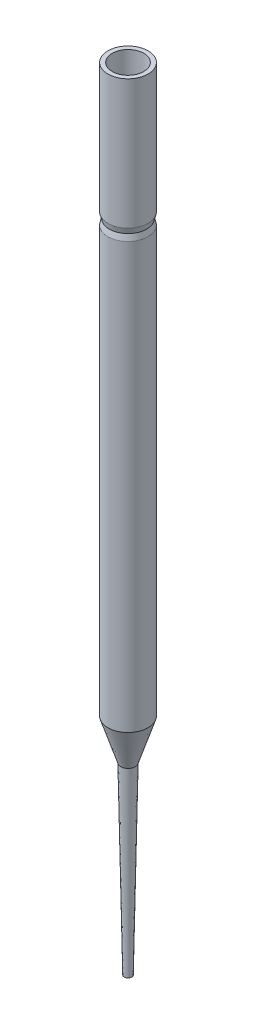
ISO-10303-21;
HEADER;
FILE_DESCRIPTION(('STEP AP214'),'2;1');
FILE_NAME('part.step','',(''),(''),'','','');
FILE_SCHEMA(('AUTOMOTIVE_DESIGN { 1 0 10303 214 1 1 1 1 }'));
ENDSEC;
DATA;
#1=APPLICATION_CONTEXT('core data for automotive mechanical design processes');
#2=APPLICATION_PROTOCOL_DEFINITION('international standard','automotive_design',2000,#1);
#3=PRODUCT_CONTEXT('',#1,'mechanical');
#4=PRODUCT('Part','Part','',(#3));
#5=PRODUCT_RELATED_PRODUCT_CATEGORY('part','',(#4));
#6=PRODUCT_DEFINITION_FORMATION('','',#4);
#7=PRODUCT_DEFINITION_CONTEXT('part definition',#1,'design');
#8=PRODUCT_DEFINITION('design','',#6,#7);
#9=PRODUCT_DEFINITION_SHAPE('','',#8);
#10=(LENGTH_UNIT() NAMED_UNIT(*) SI_UNIT(.MILLI.,.METRE.));
#11=(NAMED_UNIT(*) PLANE_ANGLE_UNIT() SI_UNIT($,.RADIAN.));
#12=(NAMED_UNIT(*) SI_UNIT($,.STERADIAN.) SOLID_ANGLE_UNIT());
#13=UNCERTAINTY_MEASURE_WITH_UNIT(LENGTH_MEASURE(1.E-05),#10,'distance_accuracy_value','');
#14=(GEOMETRIC_REPRESENTATION_CONTEXT(3) GLOBAL_UNCERTAINTY_ASSIGNED_CONTEXT((#13)) GLOBAL_UNIT_ASSIGNED_CONTEXT((#10,
#11,#12)) REPRESENTATION_CONTEXT('',''));
#15=CARTESIAN_POINT('',(0.,0.,0.));
#16=DIRECTION('',(0.,0.,1.));
#17=DIRECTION('',(1.,0.,0.));
#18=AXIS2_PLACEMENT_3D('',#15,#16,#17);
#19=CARTESIAN_POINT('',(-2.75,0.,0.));
#20=DIRECTION('',(0.,-1.,0.));
#21=DIRECTION('',(0.,0.,-1.));
#22=AXIS2_PLACEMENT_3D('',#19,#20,#21);
#23=PLANE('',#22);
#24=CARTESIAN_POINT('',(0.,0.,0.));
#25=DIRECTION('',(0.,-1.,0.));
#26=DIRECTION('',(0.,0.,-1.));
#27=AXIS2_PLACEMENT_3D('',#24,#25,#26);
#28=CIRCLE('',#27,3.5);
#29=CARTESIAN_POINT('',(0.,0.,-3.5));
#30=VERTEX_POINT('',#29);
#31=EDGE_CURVE('E10',#30,#30,#28,.T.);
#32=ORIENTED_EDGE('',*,*,#31,.F.);
#33=EDGE_LOOP('',(#32));
#34=FACE_BOUND('',#33,.T.);
#35=CARTESIAN_POINT('',(0.,0.,0.));
#36=DIRECTION('',(0.,-1.,0.));
#37=DIRECTION('',(0.,0.,-1.));
#38=AXIS2_PLACEMENT_3D('',#35,#36,#37);
#39=CIRCLE('',#38,2.75);
#40=CARTESIAN_POINT('',(0.,0.,-2.75));
#41=VERTEX_POINT('',#40);
#42=EDGE_CURVE('E77',#41,#41,#39,.T.);
#43=ORIENTED_EDGE('',*,*,#42,.T.);
#44=EDGE_LOOP('',(#43));
#45=FACE_BOUND('',#44,.T.);
#46=ADVANCED_FACE('F31',(#34,#45),#23,.F.);
#47=CARTESIAN_POINT('',(0.,0.,0.));
#48=DIRECTION('',(0.,-1.,0.));
#49=DIRECTION('',(0.,0.,-1.));
#50=AXIS2_PLACEMENT_3D('',#47,#48,#49);
#51=CYLINDRICAL_SURFACE('',#50,3.5);
#52=CARTESIAN_POINT('',(0.,-22.5,0.));
#53=DIRECTION('',(0.,-1.,0.));
#54=DIRECTION('',(0.,0.,-1.));
#55=AXIS2_PLACEMENT_3D('',#52,#53,#54);
#56=CIRCLE('',#55,3.5);
#57=CARTESIAN_POINT('',(0.,-22.5,-3.5));
#58=VERTEX_POINT('',#57);
#59=EDGE_CURVE('E37',#58,#58,#56,.T.);
#60=ORIENTED_EDGE('',*,*,#59,.F.);
#61=EDGE_LOOP('',(#60));
#62=FACE_BOUND('',#61,.T.);
#63=ORIENTED_EDGE('',*,*,#31,.T.);
#64=EDGE_LOOP('',(#63));
#65=FACE_BOUND('',#64,.T.);
#66=ADVANCED_FACE('F150',(#62,#65),#51,.T.);
#67=CARTESIAN_POINT('',(0.,-22.5,0.));
#68=DIRECTION('',(0.,1.,0.));
#69=DIRECTION('',(0.,0.,1.));
#70=AXIS2_PLACEMENT_3D('',#67,#68,#69);
#71=CONICAL_SURFACE('',#70,3.5,0.244978663126861);
#72=CARTESIAN_POINT('',(0.,-23.5,0.));
#73=DIRECTION('',(0.,-1.,0.));
#74=DIRECTION('',(0.,0.,-1.));
#75=AXIS2_PLACEMENT_3D('',#72,#73,#74);
#76=CIRCLE('',#75,3.25);
#77=CARTESIAN_POINT('',(0.,-23.5,-3.25));
#78=VERTEX_POINT('',#77);
#79=EDGE_CURVE('E41',#78,#78,#76,.T.);
#80=ORIENTED_EDGE('',*,*,#79,.F.);
#81=EDGE_LOOP('',(#80));
#82=FACE_BOUND('',#81,.T.);
#83=ORIENTED_EDGE('',*,*,#59,.T.);
#84=EDGE_LOOP('',(#83));
#85=FACE_BOUND('',#84,.T.);
#86=ADVANCED_FACE('F145',(#82,#85),#71,.T.);
#87=CARTESIAN_POINT('',(0.,-23.5,0.));
#88=DIRECTION('',(0.,-1.,0.));
#89=DIRECTION('',(0.,0.,-1.));
#90=AXIS2_PLACEMENT_3D('',#87,#88,#89);
#91=CONICAL_SURFACE('',#90,3.25,0.244978663126863);
#92=CARTESIAN_POINT('',(0.,-24.5,0.));
#93=DIRECTION('',(0.,-1.,0.));
#94=DIRECTION('',(0.,0.,-1.));
#95=AXIS2_PLACEMENT_3D('',#92,#93,#94);
#96=CIRCLE('',#95,3.5);
#97=CARTESIAN_POINT('',(0.,-24.5,-3.5));
#98=VERTEX_POINT('',#97);
#99=EDGE_CURVE('E45',#98,#98,#96,.T.);
#100=ORIENTED_EDGE('',*,*,#99,.F.);
#101=EDGE_LOOP('',(#100));
#102=FACE_BOUND('',#101,.T.);
#103=ORIENTED_EDGE('',*,*,#79,.T.);
#104=EDGE_LOOP('',(#103));
#105=FACE_BOUND('',#104,.T.);
#106=ADVANCED_FACE('F139',(#102,#105),#91,.T.);
#107=CARTESIAN_POINT('',(0.,0.,0.));
#108=DIRECTION('',(0.,-1.,0.));
#109=DIRECTION('',(0.,0.,-1.));
#110=AXIS2_PLACEMENT_3D('',#107,#108,#109);
#111=CYLINDRICAL_SURFACE('',#110,3.49999999999999);
#112=CARTESIAN_POINT('',(0.,-98.5,0.));
#113=DIRECTION('',(0.,-1.,0.));
#114=DIRECTION('',(0.,0.,-1.));
#115=AXIS2_PLACEMENT_3D('',#112,#113,#114);
#116=CIRCLE('',#115,3.49999999999999);
#117=CARTESIAN_POINT('',(0.,-98.5,-3.49999999999999));
#118=VERTEX_POINT('',#117);
#119=EDGE_CURVE('E50',#118,#118,#116,.T.);
#120=ORIENTED_EDGE('',*,*,#119,.F.);
#121=EDGE_LOOP('',(#120));
#122=FACE_BOUND('',#121,.T.);
#123=ORIENTED_EDGE('',*,*,#99,.T.);
#124=EDGE_LOOP('',(#123));
#125=FACE_BOUND('',#124,.T.);
#126=ADVANCED_FACE('F133',(#122,#125),#111,.T.);
#127=CARTESIAN_POINT('',(0.,-98.5,0.));
#128=DIRECTION('',(0.,1.,0.));
#129=DIRECTION('',(0.,0.,1.));
#130=AXIS2_PLACEMENT_3D('',#127,#128,#129);
#131=CONICAL_SURFACE('',#130,3.49999999999999,0.310998280605539);
#132=CARTESIAN_POINT('',(0.,-105.5,0.));
#133=DIRECTION('',(0.,-1.,0.));
#134=DIRECTION('',(0.,0.,-1.));
#135=AXIS2_PLACEMENT_3D('',#132,#133,#134);
#136=CIRCLE('',#135,1.25);
#137=CARTESIAN_POINT('',(0.,-105.5,-1.25));
#138=VERTEX_POINT('',#137);
#139=EDGE_CURVE('E53',#138,#138,#136,.T.);
#140=ORIENTED_EDGE('',*,*,#139,.F.);
#141=EDGE_LOOP('',(#140));
#142=FACE_BOUND('',#141,.T.);
#143=ORIENTED_EDGE('',*,*,#119,.T.);
#144=EDGE_LOOP('',(#143));
#145=FACE_BOUND('',#144,.T.);
#146=ADVANCED_FACE('F127',(#142,#145),#131,.T.);
#147=CARTESIAN_POINT('',(0.,-105.5,0.));
#148=DIRECTION('',(0.,1.,0.));
#149=DIRECTION('',(0.,0.,1.));
#150=AXIS2_PLACEMENT_3D('',#147,#148,#149);
#151=CONICAL_SURFACE('',#150,1.25,0.0187478031977444);
#152=CARTESIAN_POINT('',(0.,-137.5,0.));
#153=DIRECTION('',(0.,-1.,0.));
#154=DIRECTION('',(0.,0.,-1.));
#155=AXIS2_PLACEMENT_3D('',#152,#153,#154);
#156=CIRCLE('',#155,0.65);
#157=CARTESIAN_POINT('',(0.,-137.5,-0.65));
#158=VERTEX_POINT('',#157);
#159=EDGE_CURVE('E56',#158,#158,#156,.T.);
#160=ORIENTED_EDGE('',*,*,#159,.F.);
#161=EDGE_LOOP('',(#160));
#162=FACE_BOUND('',#161,.T.);
#163=ORIENTED_EDGE('',*,*,#139,.T.);
#164=EDGE_LOOP('',(#163));
#165=FACE_BOUND('',#164,.T.);
#166=ADVANCED_FACE('F121',(#162,#165),#151,.T.);
#167=CARTESIAN_POINT('',(-0.4,-137.5,0.));
#168=DIRECTION('',(0.,1.,0.));
#169=DIRECTION('',(0.,0.,1.));
#170=AXIS2_PLACEMENT_3D('',#167,#168,#169);
#171=PLANE('',#170);
#172=CARTESIAN_POINT('',(0.,-137.5,0.));
#173=DIRECTION('',(0.,-1.,0.));
#174=DIRECTION('',(0.,0.,-1.));
#175=AXIS2_PLACEMENT_3D('',#172,#173,#174);
#176=CIRCLE('',#175,0.4);
#177=CARTESIAN_POINT('',(0.,-137.5,-0.4));
#178=VERTEX_POINT('',#177);
#179=EDGE_CURVE('E59',#178,#178,#176,.T.);
#180=ORIENTED_EDGE('',*,*,#179,.F.);
#181=EDGE_LOOP('',(#180));
#182=FACE_BOUND('',#181,.T.);
#183=ORIENTED_EDGE('',*,*,#159,.T.);
#184=EDGE_LOOP('',(#183));
#185=FACE_BOUND('',#184,.T.);
#186=ADVANCED_FACE('F115',(#182,#185),#171,.F.);
#187=CARTESIAN_POINT('',(0.,-137.5,0.));
#188=DIRECTION('',(0.,1.,0.));
#189=DIRECTION('',(0.,0.,1.));
#190=AXIS2_PLACEMENT_3D('',#187,#188,#189);
#191=CONICAL_SURFACE('',#190,0.4,0.0187478031977444);
#192=CARTESIAN_POINT('',(0.,-105.5,0.));
#193=DIRECTION('',(0.,-1.,0.));
#194=DIRECTION('',(0.,0.,-1.));
#195=AXIS2_PLACEMENT_3D('',#192,#193,#194);
#196=CIRCLE('',#195,1.);
#197=CARTESIAN_POINT('',(0.,-105.5,-1.));
#198=VERTEX_POINT('',#197);
#199=EDGE_CURVE('E62',#198,#198,#196,.T.);
#200=ORIENTED_EDGE('',*,*,#199,.F.);
#201=EDGE_LOOP('',(#200));
#202=FACE_BOUND('',#201,.T.);
#203=ORIENTED_EDGE('',*,*,#179,.T.);
#204=EDGE_LOOP('',(#203));
#205=FACE_BOUND('',#204,.T.);
#206=ADVANCED_FACE('F109',(#202,#205),#191,.F.);
#207=CARTESIAN_POINT('',(0.,-105.5,0.));
#208=DIRECTION('',(0.,1.,0.));
#209=DIRECTION('',(0.,0.,1.));
#210=AXIS2_PLACEMENT_3D('',#207,#208,#209);
#211=CONICAL_SURFACE('',#210,1.,0.244978663126864);
#212=CARTESIAN_POINT('',(0.,-98.5,0.));
#213=DIRECTION('',(0.,-1.,0.));
#214=DIRECTION('',(0.,0.,-1.));
#215=AXIS2_PLACEMENT_3D('',#212,#213,#214);
#216=CIRCLE('',#215,2.75);
#217=CARTESIAN_POINT('',(0.,-98.5,-2.75));
#218=VERTEX_POINT('',#217);
#219=EDGE_CURVE('E65',#218,#218,#216,.T.);
#220=ORIENTED_EDGE('',*,*,#219,.F.);
#221=EDGE_LOOP('',(#220));
#222=FACE_BOUND('',#221,.T.);
#223=ORIENTED_EDGE('',*,*,#199,.T.);
#224=EDGE_LOOP('',(#223));
#225=FACE_BOUND('',#224,.T.);
#226=ADVANCED_FACE('F103',(#222,#225),#211,.F.);
#227=CARTESIAN_POINT('',(0.,0.,0.));
#228=DIRECTION('',(0.,-1.,0.));
#229=DIRECTION('',(0.,0.,-1.));
#230=AXIS2_PLACEMENT_3D('',#227,#228,#229);
#231=CYLINDRICAL_SURFACE('',#230,2.75);
#232=CARTESIAN_POINT('',(0.,-24.5,0.));
#233=DIRECTION('',(0.,-1.,0.));
#234=DIRECTION('',(0.,0.,-1.));
#235=AXIS2_PLACEMENT_3D('',#232,#233,#234);
#236=CIRCLE('',#235,2.75);
#237=CARTESIAN_POINT('',(0.,-24.5,-2.75));
#238=VERTEX_POINT('',#237);
#239=EDGE_CURVE('E68',#238,#238,#236,.T.);
#240=ORIENTED_EDGE('',*,*,#239,.F.);
#241=EDGE_LOOP('',(#240));
#242=FACE_BOUND('',#241,.T.);
#243=ORIENTED_EDGE('',*,*,#219,.T.);
#244=EDGE_LOOP('',(#243));
#245=FACE_BOUND('',#244,.T.);
#246=ADVANCED_FACE('F97',(#242,#245),#231,.F.);
#247=CARTESIAN_POINT('',(0.,-24.5,0.));
#248=DIRECTION('',(0.,-1.,0.));
#249=DIRECTION('',(0.,0.,-1.));
#250=AXIS2_PLACEMENT_3D('',#247,#248,#249);
#251=CONICAL_SURFACE('',#250,2.75,0.244978663126864);
#252=CARTESIAN_POINT('',(0.,-23.5,0.));
#253=DIRECTION('',(0.,-1.,0.));
#254=DIRECTION('',(0.,0.,-1.));
#255=AXIS2_PLACEMENT_3D('',#252,#253,#254);
#256=CIRCLE('',#255,2.5);
#257=CARTESIAN_POINT('',(0.,-23.5,-2.5));
#258=VERTEX_POINT('',#257);
#259=EDGE_CURVE('E71',#258,#258,#256,.T.);
#260=ORIENTED_EDGE('',*,*,#259,.F.);
#261=EDGE_LOOP('',(#260));
#262=FACE_BOUND('',#261,.T.);
#263=ORIENTED_EDGE('',*,*,#239,.T.);
#264=EDGE_LOOP('',(#263));
#265=FACE_BOUND('',#264,.T.);
#266=ADVANCED_FACE('F91',(#262,#265),#251,.F.);
#267=CARTESIAN_POINT('',(0.,-23.5,0.));
#268=DIRECTION('',(0.,1.,0.));
#269=DIRECTION('',(0.,0.,1.));
#270=AXIS2_PLACEMENT_3D('',#267,#268,#269);
#271=CONICAL_SURFACE('',#270,2.5,0.244978663126861);
#272=CARTESIAN_POINT('',(0.,-22.5,0.));
#273=DIRECTION('',(0.,-1.,0.));
#274=DIRECTION('',(0.,0.,-1.));
#275=AXIS2_PLACEMENT_3D('',#272,#273,#274);
#276=CIRCLE('',#275,2.75);
#277=CARTESIAN_POINT('',(0.,-22.5,-2.75));
#278=VERTEX_POINT('',#277);
#279=EDGE_CURVE('E74',#278,#278,#276,.T.);
#280=ORIENTED_EDGE('',*,*,#279,.F.);
#281=EDGE_LOOP('',(#280));
#282=FACE_BOUND('',#281,.T.);
#283=ORIENTED_EDGE('',*,*,#259,.T.);
#284=EDGE_LOOP('',(#283));
#285=FACE_BOUND('',#284,.T.);
#286=ADVANCED_FACE('F85',(#282,#285),#271,.F.);
#287=CARTESIAN_POINT('',(0.,0.,0.));
#288=DIRECTION('',(0.,-1.,0.));
#289=DIRECTION('',(0.,0.,-1.));
#290=AXIS2_PLACEMENT_3D('',#287,#288,#289);
#291=CYLINDRICAL_SURFACE('',#290,2.75);
#292=ORIENTED_EDGE('',*,*,#42,.F.);
#293=EDGE_LOOP('',(#292));
#294=FACE_BOUND('',#293,.T.);
#295=ORIENTED_EDGE('',*,*,#279,.T.);
#296=EDGE_LOOP('',(#295));
#297=FACE_BOUND('',#296,.T.);
#298=ADVANCED_FACE('F82',(#294,#297),#291,.F.);
#299=CLOSED_SHELL('',(#46,#66,#86,#106,#126,#146,#166,#186,#206,#226,#246,#266,#286,#298));
#300=MANIFOLD_SOLID_BREP('B2',#299);
#301=ADVANCED_BREP_SHAPE_REPRESENTATION('',(#18,#300),#14);
#302=SHAPE_DEFINITION_REPRESENTATION(#9,#301);
ENDSEC;
END-ISO-10303-21;
